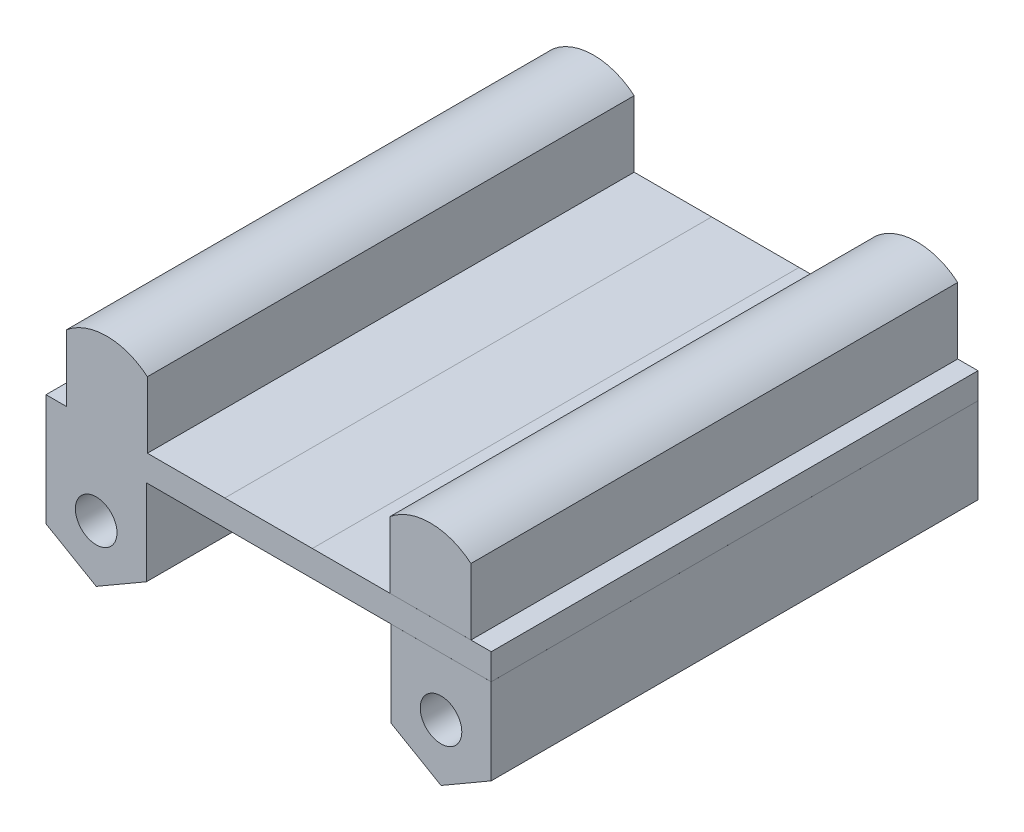
ISO-10303-21;
HEADER;
FILE_DESCRIPTION(('STEP AP214'),'2;1');
FILE_NAME('part.step','',(''),(''),'','','');
FILE_SCHEMA(('AUTOMOTIVE_DESIGN { 1 0 10303 214 1 1 1 1 }'));
ENDSEC;
DATA;
#1=APPLICATION_CONTEXT('core data for automotive mechanical design processes');
#2=APPLICATION_PROTOCOL_DEFINITION('international standard','automotive_design',2000,#1);
#3=PRODUCT_CONTEXT('',#1,'mechanical');
#4=PRODUCT('Part','Part','',(#3));
#5=PRODUCT_RELATED_PRODUCT_CATEGORY('part','',(#4));
#6=PRODUCT_DEFINITION_FORMATION('','',#4);
#7=PRODUCT_DEFINITION_CONTEXT('part definition',#1,'design');
#8=PRODUCT_DEFINITION('design','',#6,#7);
#9=PRODUCT_DEFINITION_SHAPE('','',#8);
#10=(LENGTH_UNIT() NAMED_UNIT(*) SI_UNIT(.MILLI.,.METRE.));
#11=(NAMED_UNIT(*) PLANE_ANGLE_UNIT() SI_UNIT($,.RADIAN.));
#12=(NAMED_UNIT(*) SI_UNIT($,.STERADIAN.) SOLID_ANGLE_UNIT());
#13=UNCERTAINTY_MEASURE_WITH_UNIT(LENGTH_MEASURE(1.E-05),#10,'distance_accuracy_value','');
#14=(GEOMETRIC_REPRESENTATION_CONTEXT(3) GLOBAL_UNCERTAINTY_ASSIGNED_CONTEXT((#13)) GLOBAL_UNIT_ASSIGNED_CONTEXT((#10,
#11,#12)) REPRESENTATION_CONTEXT('',''));
#15=CARTESIAN_POINT('',(0.,0.,0.));
#16=DIRECTION('',(0.,0.,1.));
#17=DIRECTION('',(1.,0.,0.));
#18=AXIS2_PLACEMENT_3D('',#15,#16,#17);
#19=CARTESIAN_POINT('',(20.9500619988679,0.,0.));
#20=DIRECTION('',(1.,0.,0.));
#21=DIRECTION('',(0.,0.,-1.));
#22=AXIS2_PLACEMENT_3D('',#19,#20,#21);
#23=PLANE('',#22);
#24=DIRECTION('',(0.,1.,0.));
#25=VECTOR('',#24,1.);
#26=CARTESIAN_POINT('',(20.9500619988679,0.,24.));
#27=LINE('',#26,#25);
#28=CARTESIAN_POINT('',(20.9500619988679,1.28447350081728,24.));
#29=VERTEX_POINT('',#28);
#30=CARTESIAN_POINT('',(20.9500619988679,4.55180037199449,24.));
#31=VERTEX_POINT('',#30);
#32=EDGE_CURVE('E184',#29,#31,#27,.T.);
#33=ORIENTED_EDGE('',*,*,#32,.F.);
#34=DIRECTION('',(0.,0.,1.));
#35=VECTOR('',#34,1.);
#36=CARTESIAN_POINT('',(20.9500619988679,1.28447350081728,0.));
#37=LINE('',#36,#35);
#38=CARTESIAN_POINT('',(20.9500619988679,1.28447350081728,0.));
#39=VERTEX_POINT('',#38);
#40=EDGE_CURVE('E13',#39,#29,#37,.T.);
#41=ORIENTED_EDGE('',*,*,#40,.F.);
#42=DIRECTION('',(0.,1.,0.));
#43=VECTOR('',#42,1.);
#44=CARTESIAN_POINT('',(20.9500619988679,0.,0.));
#45=LINE('',#44,#43);
#46=CARTESIAN_POINT('',(20.9500619988679,4.55180037199449,0.));
#47=VERTEX_POINT('',#46);
#48=EDGE_CURVE('E179',#39,#47,#45,.T.);
#49=ORIENTED_EDGE('',*,*,#48,.T.);
#50=DIRECTION('',(0.,0.,1.));
#51=VECTOR('',#50,1.);
#52=CARTESIAN_POINT('',(20.9500619988679,4.55180037199449,0.));
#53=LINE('',#52,#51);
#54=EDGE_CURVE('E122',#47,#31,#53,.T.);
#55=ORIENTED_EDGE('',*,*,#54,.T.);
#56=EDGE_LOOP('',(#33,#41,#49,#55));
#57=FACE_BOUND('',#56,.T.);
#58=ADVANCED_FACE('F119',(#57),#23,.T.);
#59=CARTESIAN_POINT('',(0.,1.28447350081728,0.));
#60=DIRECTION('',(0.,1.,0.));
#61=DIRECTION('',(0.,0.,1.));
#62=AXIS2_PLACEMENT_3D('',#59,#60,#61);
#63=PLANE('',#62);
#64=DIRECTION('',(-1.,0.,0.));
#65=VECTOR('',#64,1.);
#66=CARTESIAN_POINT('',(0.,1.28447350081728,24.));
#67=LINE('',#66,#65);
#68=CARTESIAN_POINT('',(16.9500619988679,1.28447350081728,24.));
#69=VERTEX_POINT('',#68);
#70=EDGE_CURVE('E152',#29,#69,#67,.T.);
#71=ORIENTED_EDGE('',*,*,#70,.T.);
#72=DIRECTION('',(0.,0.,1.));
#73=VECTOR('',#72,1.);
#74=CARTESIAN_POINT('',(16.9500619988679,1.28447350081728,0.));
#75=LINE('',#74,#73);
#76=CARTESIAN_POINT('',(16.9500619988679,1.28447350081728,0.));
#77=VERTEX_POINT('',#76);
#78=EDGE_CURVE('E128',#77,#69,#75,.T.);
#79=ORIENTED_EDGE('',*,*,#78,.F.);
#80=DIRECTION('',(-1.,0.,0.));
#81=VECTOR('',#80,1.);
#82=CARTESIAN_POINT('',(0.,1.28447350081728,0.));
#83=LINE('',#82,#81);
#84=EDGE_CURVE('E169',#39,#77,#83,.T.);
#85=ORIENTED_EDGE('',*,*,#84,.F.);
#86=ORIENTED_EDGE('',*,*,#40,.T.);
#87=EDGE_LOOP('',(#71,#79,#85,#86));
#88=FACE_BOUND('',#87,.T.);
#89=ADVANCED_FACE('F194',(#88),#63,.F.);
#90=CARTESIAN_POINT('',(16.9500619988679,0.,0.));
#91=DIRECTION('',(1.,0.,0.));
#92=DIRECTION('',(0.,0.,-1.));
#93=AXIS2_PLACEMENT_3D('',#90,#91,#92);
#94=PLANE('',#93);
#95=DIRECTION('',(0.,1.,0.));
#96=VECTOR('',#95,1.);
#97=CARTESIAN_POINT('',(16.9500619988679,0.,24.));
#98=LINE('',#97,#96);
#99=CARTESIAN_POINT('',(16.9500619988679,4.55180037199449,24.));
#100=VERTEX_POINT('',#99);
#101=EDGE_CURVE('E176',#69,#100,#98,.T.);
#102=ORIENTED_EDGE('',*,*,#101,.T.);
#103=DIRECTION('',(0.,0.,1.));
#104=VECTOR('',#103,1.);
#105=CARTESIAN_POINT('',(16.9500619988679,4.55180037199449,0.));
#106=LINE('',#105,#104);
#107=CARTESIAN_POINT('',(16.9500619988679,4.55180037199449,0.));
#108=VERTEX_POINT('',#107);
#109=EDGE_CURVE('E173',#108,#100,#106,.T.);
#110=ORIENTED_EDGE('',*,*,#109,.F.);
#111=DIRECTION('',(0.,1.,0.));
#112=VECTOR('',#111,1.);
#113=CARTESIAN_POINT('',(16.9500619988679,0.,0.));
#114=LINE('',#113,#112);
#115=EDGE_CURVE('E164',#77,#108,#114,.T.);
#116=ORIENTED_EDGE('',*,*,#115,.F.);
#117=ORIENTED_EDGE('',*,*,#78,.T.);
#118=EDGE_LOOP('',(#102,#110,#116,#117));
#119=FACE_BOUND('',#118,.T.);
#120=ADVANCED_FACE('F174',(#119),#94,.F.);
#121=CARTESIAN_POINT('',(18.9500619988679,2.18840669065026,0.));
#122=DIRECTION('',(0.,0.,1.));
#123=DIRECTION('',(1.,0.,0.));
#124=AXIS2_PLACEMENT_3D('',#121,#122,#123);
#125=CYLINDRICAL_SURFACE('',#124,3.09606681016702);
#126=CARTESIAN_POINT('',(18.9500619988679,2.18840669065026,24.));
#127=DIRECTION('',(0.,0.,1.));
#128=DIRECTION('',(1.,0.,0.));
#129=AXIS2_PLACEMENT_3D('',#126,#127,#128);
#130=CIRCLE('',#129,3.09606681016702);
#131=EDGE_CURVE('E187',#31,#100,#130,.T.);
#132=ORIENTED_EDGE('',*,*,#131,.F.);
#133=ORIENTED_EDGE('',*,*,#54,.F.);
#134=CARTESIAN_POINT('',(18.9500619988679,2.18840669065026,0.));
#135=DIRECTION('',(0.,0.,1.));
#136=DIRECTION('',(1.,0.,0.));
#137=AXIS2_PLACEMENT_3D('',#134,#135,#136);
#138=CIRCLE('',#137,3.09606681016702);
#139=EDGE_CURVE('E168',#47,#108,#138,.T.);
#140=ORIENTED_EDGE('',*,*,#139,.T.);
#141=ORIENTED_EDGE('',*,*,#109,.T.);
#142=EDGE_LOOP('',(#132,#133,#140,#141));
#143=FACE_BOUND('',#142,.T.);
#144=ADVANCED_FACE('F178',(#143),#125,.T.);
#145=CARTESIAN_POINT('',(0.,0.,0.));
#146=DIRECTION('',(0.,0.,1.));
#147=DIRECTION('',(1.,0.,0.));
#148=AXIS2_PLACEMENT_3D('',#145,#146,#147);
#149=PLANE('',#148);
#150=ORIENTED_EDGE('',*,*,#48,.F.);
#151=ORIENTED_EDGE('',*,*,#84,.T.);
#152=ORIENTED_EDGE('',*,*,#115,.T.);
#153=ORIENTED_EDGE('',*,*,#139,.F.);
#154=EDGE_LOOP('',(#150,#151,#152,#153));
#155=FACE_BOUND('',#154,.T.);
#156=ADVANCED_FACE('F167',(#155),#149,.F.);
#157=CARTESIAN_POINT('',(0.,0.,24.));
#158=DIRECTION('',(0.,0.,1.));
#159=DIRECTION('',(1.,0.,0.));
#160=AXIS2_PLACEMENT_3D('',#157,#158,#159);
#161=PLANE('',#160);
#162=ORIENTED_EDGE('',*,*,#32,.T.);
#163=ORIENTED_EDGE('',*,*,#131,.T.);
#164=ORIENTED_EDGE('',*,*,#101,.F.);
#165=ORIENTED_EDGE('',*,*,#70,.F.);
#166=EDGE_LOOP('',(#162,#163,#164,#165));
#167=FACE_BOUND('',#166,.T.);
#168=ADVANCED_FACE('F192',(#167),#161,.T.);
#169=CLOSED_SHELL('',(#58,#89,#120,#144,#156,#168));
#170=MANIFOLD_SOLID_BREP('B2',#169);
#171=CARTESIAN_POINT('',(21.9498374651923,-0.000939459391635629,24.));
#172=DIRECTION('',(-0.999999999084068,4.28002891713858E-05,0.));
#173=DIRECTION('',(-4.28002891713858E-05,-0.999999999084068,0.));
#174=AXIS2_PLACEMENT_3D('',#171,#172,#173);
#175=PLANE('',#174);
#176=DIRECTION('',(4.28002891713858E-05,0.999999999084068,0.));
#177=VECTOR('',#176,1.);
#178=CARTESIAN_POINT('',(21.9498374651923,-0.000939459391635629,0.));
#179=LINE('',#178,#177);
#180=CARTESIAN_POINT('',(21.9498374852968,-0.000469729696067488,0.));
#181=VERTEX_POINT('',#180);
#182=CARTESIAN_POINT('',(21.9498375054014,0.,0.));
#183=VERTEX_POINT('',#182);
#184=EDGE_CURVE('E355',#181,#183,#179,.T.);
#185=ORIENTED_EDGE('',*,*,#184,.F.);
#186=DIRECTION('',(0.,0.,-1.));
#187=VECTOR('',#186,1.);
#188=CARTESIAN_POINT('',(21.9498374852968,-0.000469729696067488,24.));
#189=LINE('',#188,#187);
#190=CARTESIAN_POINT('',(21.9498374852968,-0.000469729696067488,24.));
#191=VERTEX_POINT('',#190);
#192=EDGE_CURVE('E117',#191,#181,#189,.T.);
#193=ORIENTED_EDGE('',*,*,#192,.F.);
#194=DIRECTION('',(4.28002891713858E-05,0.999999999084068,0.));
#195=VECTOR('',#194,1.);
#196=CARTESIAN_POINT('',(21.9498374651923,-0.000939459391635629,24.));
#197=LINE('',#196,#195);
#198=CARTESIAN_POINT('',(21.9498375054014,0.,24.));
#199=VERTEX_POINT('',#198);
#200=EDGE_CURVE('E370',#191,#199,#197,.T.);
#201=ORIENTED_EDGE('',*,*,#200,.T.);
#202=DIRECTION('',(0.,0.,-1.));
#203=VECTOR('',#202,1.);
#204=CARTESIAN_POINT('',(21.9498375054014,0.,24.));
#205=LINE('',#204,#203);
#206=EDGE_CURVE('E283',#199,#183,#205,.T.);
#207=ORIENTED_EDGE('',*,*,#206,.T.);
#208=EDGE_LOOP('',(#185,#193,#201,#207));
#209=FACE_BOUND('',#208,.T.);
#210=ADVANCED_FACE('F267',(#209),#175,.T.);
#211=CARTESIAN_POINT('',(2.01045668255545E-08,0.000469729695637247,24.));
#212=DIRECTION('',(-4.28002891745342E-05,-0.999999999084068,0.));
#213=DIRECTION('',(0.999999999084068,-4.28002891745342E-05,0.));
#214=AXIS2_PLACEMENT_3D('',#211,#212,#213);
#215=PLANE('',#214);
#216=DIRECTION('',(-0.999999999084068,4.28002891745342E-05,0.));
#217=VECTOR('',#216,1.);
#218=CARTESIAN_POINT('',(2.01045668255545E-08,0.000469729695637247,0.));
#219=LINE('',#218,#217);
#220=CARTESIAN_POINT('',(17.,-0.00025787522013579,0.));
#221=VERTEX_POINT('',#220);
#222=EDGE_CURVE('E357',#181,#221,#219,.T.);
#223=ORIENTED_EDGE('',*,*,#222,.T.);
#224=DIRECTION('',(0.,0.,-1.));
#225=VECTOR('',#224,1.);
#226=CARTESIAN_POINT('',(17.,-0.00025787522013579,24.));
#227=LINE('',#226,#225);
#228=CARTESIAN_POINT('',(17.,-0.00025787522013579,24.));
#229=VERTEX_POINT('',#228);
#230=EDGE_CURVE('E275',#229,#221,#227,.T.);
#231=ORIENTED_EDGE('',*,*,#230,.F.);
#232=DIRECTION('',(-0.999999999084068,4.28002891745342E-05,0.));
#233=VECTOR('',#232,1.);
#234=CARTESIAN_POINT('',(2.01045668255545E-08,0.000469729695637247,24.));
#235=LINE('',#234,#233);
#236=EDGE_CURVE('E391',#191,#229,#235,.T.);
#237=ORIENTED_EDGE('',*,*,#236,.F.);
#238=ORIENTED_EDGE('',*,*,#192,.T.);
#239=EDGE_LOOP('',(#223,#231,#237,#238));
#240=FACE_BOUND('',#239,.T.);
#241=ADVANCED_FACE('F449',(#240),#215,.F.);
#242=CARTESIAN_POINT('',(17.,0.,24.));
#243=DIRECTION('',(1.,0.,0.));
#244=DIRECTION('',(0.,0.,-1.));
#245=AXIS2_PLACEMENT_3D('',#242,#243,#244);
#246=PLANE('',#245);
#247=DIRECTION('',(0.,-1.,0.));
#248=VECTOR('',#247,1.);
#249=CARTESIAN_POINT('',(17.,0.,0.));
#250=LINE('',#249,#248);
#251=CARTESIAN_POINT('',(17.,-4.23,0.));
#252=VERTEX_POINT('',#251);
#253=EDGE_CURVE('E360',#221,#252,#250,.T.);
#254=ORIENTED_EDGE('',*,*,#253,.T.);
#255=DIRECTION('',(0.,0.,-1.));
#256=VECTOR('',#255,1.);
#257=CARTESIAN_POINT('',(17.,-4.23,24.));
#258=LINE('',#257,#256);
#259=CARTESIAN_POINT('',(17.,-4.23,24.));
#260=VERTEX_POINT('',#259);
#261=EDGE_CURVE('E374',#260,#252,#258,.T.);
#262=ORIENTED_EDGE('',*,*,#261,.F.);
#263=DIRECTION('',(0.,-1.,0.));
#264=VECTOR('',#263,1.);
#265=CARTESIAN_POINT('',(17.,0.,24.));
#266=LINE('',#265,#264);
#267=EDGE_CURVE('E383',#229,#260,#266,.T.);
#268=ORIENTED_EDGE('',*,*,#267,.F.);
#269=ORIENTED_EDGE('',*,*,#230,.T.);
#270=EDGE_LOOP('',(#254,#262,#268,#269));
#271=FACE_BOUND('',#270,.T.);
#272=ADVANCED_FACE('F381',(#271),#246,.F.);
#273=CARTESIAN_POINT('',(2.4345156901417,4.2042661826246,24.));
#274=DIRECTION('',(0.50110823926136,0.865384615384616,0.));
#275=DIRECTION('',(-0.865384615384616,0.50110823926136,0.));
#276=AXIS2_PLACEMENT_3D('',#273,#274,#275);
#277=PLANE('',#276);
#278=DIRECTION('',(0.865384615384616,-0.50110823926136,0.));
#279=VECTOR('',#278,1.);
#280=CARTESIAN_POINT('',(2.4345156901417,4.2042661826246,0.));
#281=LINE('',#280,#279);
#282=CARTESIAN_POINT('',(19.475,-5.66316956428749,0.));
#283=VERTEX_POINT('',#282);
#284=EDGE_CURVE('E362',#252,#283,#281,.T.);
#285=ORIENTED_EDGE('',*,*,#284,.T.);
#286=DIRECTION('',(0.,0.,-1.));
#287=VECTOR('',#286,1.);
#288=CARTESIAN_POINT('',(19.475,-5.66316956428749,24.));
#289=LINE('',#288,#287);
#290=CARTESIAN_POINT('',(19.475,-5.66316956428749,24.));
#291=VERTEX_POINT('',#290);
#292=EDGE_CURVE('E347',#291,#283,#289,.T.);
#293=ORIENTED_EDGE('',*,*,#292,.F.);
#294=DIRECTION('',(0.865384615384616,-0.50110823926136,0.));
#295=VECTOR('',#294,1.);
#296=CARTESIAN_POINT('',(2.4345156901417,4.2042661826246,24.));
#297=LINE('',#296,#295);
#298=EDGE_CURVE('E335',#260,#291,#297,.T.);
#299=ORIENTED_EDGE('',*,*,#298,.F.);
#300=ORIENTED_EDGE('',*,*,#261,.T.);
#301=EDGE_LOOP('',(#285,#293,#299,#300));
#302=FACE_BOUND('',#301,.T.);
#303=ADVANCED_FACE('F390',(#302),#277,.F.);
#304=CARTESIAN_POINT('',(7.34619806725475,-12.6864543244014,24.));
#305=DIRECTION('',(-0.501108239261361,0.865384615384615,0.));
#306=DIRECTION('',(-0.865384615384615,-0.501108239261361,0.));
#307=AXIS2_PLACEMENT_3D('',#304,#305,#306);
#308=PLANE('',#307);
#309=DIRECTION('',(0.865384615384615,0.501108239261361,0.));
#310=VECTOR('',#309,1.);
#311=CARTESIAN_POINT('',(7.34619806725475,-12.6864543244014,0.));
#312=LINE('',#311,#310);
#313=CARTESIAN_POINT('',(21.95,-4.23,0.));
#314=VERTEX_POINT('',#313);
#315=EDGE_CURVE('E344',#283,#314,#312,.T.);
#316=ORIENTED_EDGE('',*,*,#315,.T.);
#317=DIRECTION('',(0.,0.,-1.));
#318=VECTOR('',#317,1.);
#319=CARTESIAN_POINT('',(21.95,-4.23,24.));
#320=LINE('',#319,#318);
#321=CARTESIAN_POINT('',(21.95,-4.23,24.));
#322=VERTEX_POINT('',#321);
#323=EDGE_CURVE('E341',#322,#314,#320,.T.);
#324=ORIENTED_EDGE('',*,*,#323,.F.);
#325=DIRECTION('',(0.865384615384615,0.501108239261361,0.));
#326=VECTOR('',#325,1.);
#327=CARTESIAN_POINT('',(7.34619806725475,-12.6864543244014,24.));
#328=LINE('',#327,#326);
#329=EDGE_CURVE('E327',#291,#322,#328,.T.);
#330=ORIENTED_EDGE('',*,*,#329,.F.);
#331=ORIENTED_EDGE('',*,*,#292,.T.);
#332=EDGE_LOOP('',(#316,#324,#330,#331));
#333=FACE_BOUND('',#332,.T.);
#334=ADVANCED_FACE('F342',(#333),#308,.F.);
#335=CARTESIAN_POINT('',(21.95,0.,24.));
#336=DIRECTION('',(1.,0.,0.));
#337=DIRECTION('',(0.,0.,-1.));
#338=AXIS2_PLACEMENT_3D('',#335,#336,#337);
#339=PLANE('',#338);
#340=DIRECTION('',(0.,-1.,0.));
#341=VECTOR('',#340,1.);
#342=CARTESIAN_POINT('',(21.95,0.,0.));
#343=LINE('',#342,#341);
#344=CARTESIAN_POINT('',(21.95,0.,0.));
#345=VERTEX_POINT('',#344);
#346=EDGE_CURVE('E365',#345,#314,#343,.T.);
#347=ORIENTED_EDGE('',*,*,#346,.F.);
#348=DIRECTION('',(0.,0.,-1.));
#349=VECTOR('',#348,1.);
#350=CARTESIAN_POINT('',(21.95,0.,24.));
#351=LINE('',#350,#349);
#352=CARTESIAN_POINT('',(21.95,0.,24.));
#353=VERTEX_POINT('',#352);
#354=EDGE_CURVE('E305',#353,#345,#351,.T.);
#355=ORIENTED_EDGE('',*,*,#354,.F.);
#356=DIRECTION('',(0.,-1.,0.));
#357=VECTOR('',#356,1.);
#358=CARTESIAN_POINT('',(21.95,0.,24.));
#359=LINE('',#358,#357);
#360=EDGE_CURVE('E333',#353,#322,#359,.T.);
#361=ORIENTED_EDGE('',*,*,#360,.T.);
#362=ORIENTED_EDGE('',*,*,#323,.T.);
#363=EDGE_LOOP('',(#347,#355,#361,#362));
#364=FACE_BOUND('',#363,.T.);
#365=ADVANCED_FACE('F349',(#364),#339,.T.);
#366=CARTESIAN_POINT('',(0.,0.,24.));
#367=DIRECTION('',(0.,1.,0.));
#368=DIRECTION('',(0.,0.,1.));
#369=AXIS2_PLACEMENT_3D('',#366,#367,#368);
#370=PLANE('',#369);
#371=DIRECTION('',(1.,0.,0.));
#372=VECTOR('',#371,1.);
#373=CARTESIAN_POINT('',(0.,0.,0.));
#374=LINE('',#373,#372);
#375=EDGE_CURVE('E367',#183,#345,#374,.T.);
#376=ORIENTED_EDGE('',*,*,#375,.F.);
#377=ORIENTED_EDGE('',*,*,#206,.F.);
#378=DIRECTION('',(1.,0.,0.));
#379=VECTOR('',#378,1.);
#380=CARTESIAN_POINT('',(0.,0.,24.));
#381=LINE('',#380,#379);
#382=EDGE_CURVE('E350',#199,#353,#381,.T.);
#383=ORIENTED_EDGE('',*,*,#382,.T.);
#384=ORIENTED_EDGE('',*,*,#354,.T.);
#385=EDGE_LOOP('',(#376,#377,#383,#384));
#386=FACE_BOUND('',#385,.T.);
#387=ADVANCED_FACE('F444',(#386),#370,.T.);
#388=CARTESIAN_POINT('',(0.,0.,24.));
#389=DIRECTION('',(0.,0.,1.));
#390=DIRECTION('',(1.,0.,0.));
#391=AXIS2_PLACEMENT_3D('',#388,#389,#390);
#392=PLANE('',#391);
#393=CARTESIAN_POINT('',(19.475,-2.86316956428749,24.));
#394=DIRECTION('',(0.,0.,1.));
#395=DIRECTION('',(1.,0.,0.));
#396=AXIS2_PLACEMENT_3D('',#393,#394,#395);
#397=CIRCLE('',#396,1.025);
#398=CARTESIAN_POINT('',(20.5,-2.86316956428749,24.));
#399=VERTEX_POINT('',#398);
#400=EDGE_CURVE('E358',#399,#399,#397,.T.);
#401=ORIENTED_EDGE('',*,*,#400,.F.);
#402=EDGE_LOOP('',(#401));
#403=FACE_BOUND('',#402,.T.);
#404=ORIENTED_EDGE('',*,*,#200,.F.);
#405=ORIENTED_EDGE('',*,*,#236,.T.);
#406=ORIENTED_EDGE('',*,*,#267,.T.);
#407=ORIENTED_EDGE('',*,*,#298,.T.);
#408=ORIENTED_EDGE('',*,*,#329,.T.);
#409=ORIENTED_EDGE('',*,*,#360,.F.);
#410=ORIENTED_EDGE('',*,*,#382,.F.);
#411=EDGE_LOOP('',(#404,#405,#406,#407,#408,#409,#410));
#412=FACE_BOUND('',#411,.T.);
#413=ADVANCED_FACE('F330',(#403,#412),#392,.T.);
#414=CARTESIAN_POINT('',(0.,0.,0.));
#415=DIRECTION('',(0.,0.,1.));
#416=DIRECTION('',(1.,0.,0.));
#417=AXIS2_PLACEMENT_3D('',#414,#415,#416);
#418=PLANE('',#417);
#419=CARTESIAN_POINT('',(19.475,-2.86316956428749,0.));
#420=DIRECTION('',(0.,0.,-1.));
#421=DIRECTION('',(-1.,0.,0.));
#422=AXIS2_PLACEMENT_3D('',#419,#420,#421);
#423=CIRCLE('',#422,1.025);
#424=CARTESIAN_POINT('',(18.45,-2.86316956428749,0.));
#425=VERTEX_POINT('',#424);
#426=EDGE_CURVE('E402',#425,#425,#423,.T.);
#427=ORIENTED_EDGE('',*,*,#426,.F.);
#428=EDGE_LOOP('',(#427));
#429=FACE_BOUND('',#428,.T.);
#430=ORIENTED_EDGE('',*,*,#184,.T.);
#431=ORIENTED_EDGE('',*,*,#375,.T.);
#432=ORIENTED_EDGE('',*,*,#346,.T.);
#433=ORIENTED_EDGE('',*,*,#315,.F.);
#434=ORIENTED_EDGE('',*,*,#284,.F.);
#435=ORIENTED_EDGE('',*,*,#253,.F.);
#436=ORIENTED_EDGE('',*,*,#222,.F.);
#437=EDGE_LOOP('',(#430,#431,#432,#433,#434,#435,#436));
#438=FACE_BOUND('',#437,.T.);
#439=ADVANCED_FACE('F388',(#429,#438),#418,.F.);
#440=CARTESIAN_POINT('',(19.475,-2.86316956428749,19.));
#441=DIRECTION('',(0.,0.,1.));
#442=DIRECTION('',(1.,0.,0.));
#443=AXIS2_PLACEMENT_3D('',#440,#441,#442);
#444=CYLINDRICAL_SURFACE('',#443,1.025);
#445=CARTESIAN_POINT('',(19.475,-2.86316956428749,19.));
#446=DIRECTION('',(0.,0.,1.));
#447=DIRECTION('',(1.,0.,0.));
#448=AXIS2_PLACEMENT_3D('',#445,#446,#447);
#449=CIRCLE('',#448,1.025);
#450=CARTESIAN_POINT('',(20.5,-2.86316956428749,19.));
#451=VERTEX_POINT('',#450);
#452=EDGE_CURVE('E396',#451,#451,#449,.T.);
#453=ORIENTED_EDGE('',*,*,#452,.F.);
#454=EDGE_LOOP('',(#453));
#455=FACE_BOUND('',#454,.T.);
#456=ORIENTED_EDGE('',*,*,#400,.T.);
#457=EDGE_LOOP('',(#456));
#458=FACE_BOUND('',#457,.T.);
#459=ADVANCED_FACE('F436',(#455,#458),#444,.F.);
#460=CARTESIAN_POINT('',(19.475,-2.86316956428749,19.));
#461=DIRECTION('',(0.,0.,1.));
#462=DIRECTION('',(1.,0.,0.));
#463=AXIS2_PLACEMENT_3D('',#460,#461,#462);
#464=PLANE('',#463);
#465=CARTESIAN_POINT('',(19.475,-2.86316956428749,19.));
#466=DIRECTION('',(0.,0.,-1.));
#467=DIRECTION('',(-1.,0.,0.));
#468=AXIS2_PLACEMENT_3D('',#465,#466,#467);
#469=CIRCLE('',#468,0.9);
#470=CARTESIAN_POINT('',(18.575,-2.86316956428749,19.));
#471=VERTEX_POINT('',#470);
#472=EDGE_CURVE('E405',#471,#471,#469,.T.);
#473=ORIENTED_EDGE('',*,*,#472,.T.);
#474=EDGE_LOOP('',(#473));
#475=FACE_BOUND('',#474,.T.);
#476=ORIENTED_EDGE('',*,*,#452,.T.);
#477=EDGE_LOOP('',(#476));
#478=FACE_BOUND('',#477,.T.);
#479=ADVANCED_FACE('F414',(#475,#478),#464,.T.);
#480=CARTESIAN_POINT('',(19.475,-2.86316956428749,5.));
#481=DIRECTION('',(0.,0.,-1.));
#482=DIRECTION('',(-1.,0.,0.));
#483=AXIS2_PLACEMENT_3D('',#480,#481,#482);
#484=CYLINDRICAL_SURFACE('',#483,1.025);
#485=CARTESIAN_POINT('',(19.475,-2.86316956428749,5.));
#486=DIRECTION('',(0.,0.,-1.));
#487=DIRECTION('',(-1.,0.,0.));
#488=AXIS2_PLACEMENT_3D('',#485,#486,#487);
#489=CIRCLE('',#488,1.025);
#490=CARTESIAN_POINT('',(18.45,-2.86316956428749,5.));
#491=VERTEX_POINT('',#490);
#492=EDGE_CURVE('E399',#491,#491,#489,.T.);
#493=ORIENTED_EDGE('',*,*,#492,.F.);
#494=EDGE_LOOP('',(#493));
#495=FACE_BOUND('',#494,.T.);
#496=ORIENTED_EDGE('',*,*,#426,.T.);
#497=EDGE_LOOP('',(#496));
#498=FACE_BOUND('',#497,.T.);
#499=ADVANCED_FACE('F426',(#495,#498),#484,.F.);
#500=CARTESIAN_POINT('',(0.,0.,5.));
#501=DIRECTION('',(0.,0.,-1.));
#502=DIRECTION('',(-1.,0.,0.));
#503=AXIS2_PLACEMENT_3D('',#500,#501,#502);
#504=PLANE('',#503);
#505=CARTESIAN_POINT('',(19.475,-2.86316956428749,5.));
#506=DIRECTION('',(0.,0.,-1.));
#507=DIRECTION('',(-1.,0.,0.));
#508=AXIS2_PLACEMENT_3D('',#505,#506,#507);
#509=CIRCLE('',#508,0.9);
#510=CARTESIAN_POINT('',(18.575,-2.86316956428749,5.));
#511=VERTEX_POINT('',#510);
#512=EDGE_CURVE('E408',#511,#511,#509,.T.);
#513=ORIENTED_EDGE('',*,*,#512,.F.);
#514=EDGE_LOOP('',(#513));
#515=FACE_BOUND('',#514,.T.);
#516=ORIENTED_EDGE('',*,*,#492,.T.);
#517=EDGE_LOOP('',(#516));
#518=FACE_BOUND('',#517,.T.);
#519=ADVANCED_FACE('F420',(#515,#518),#504,.T.);
#520=CARTESIAN_POINT('',(19.475,-2.86316956428749,19.));
#521=DIRECTION('',(0.,0.,-1.));
#522=DIRECTION('',(-1.,0.,0.));
#523=AXIS2_PLACEMENT_3D('',#520,#521,#522);
#524=CYLINDRICAL_SURFACE('',#523,0.9);
#525=ORIENTED_EDGE('',*,*,#472,.F.);
#526=EDGE_LOOP('',(#525));
#527=FACE_BOUND('',#526,.T.);
#528=ORIENTED_EDGE('',*,*,#512,.T.);
#529=EDGE_LOOP('',(#528));
#530=FACE_BOUND('',#529,.T.);
#531=ADVANCED_FACE('F417',(#527,#530),#524,.F.);
#532=CLOSED_SHELL('',(#210,#241,#272,#303,#334,#365,#387,#413,#439,#459,#479,#499,#519,#531));
#533=MANIFOLD_SOLID_BREP('B7',#532);
#534=CARTESIAN_POINT('',(0.,1.28447350081728,24.));
#535=DIRECTION('',(0.,1.,0.));
#536=DIRECTION('',(0.,0.,1.));
#537=AXIS2_PLACEMENT_3D('',#534,#535,#536);
#538=PLANE('',#537);
#539=DIRECTION('',(1.,0.,0.));
#540=VECTOR('',#539,1.);
#541=CARTESIAN_POINT('',(0.,1.28447350081728,0.));
#542=LINE('',#541,#540);
#543=CARTESIAN_POINT('',(4.99983047034324,1.28447350081728,0.));
#544=VERTEX_POINT('',#543);
#545=CARTESIAN_POINT('',(8.81833490961792,1.28447350081728,0.));
#546=VERTEX_POINT('',#545);
#547=EDGE_CURVE('E722',#544,#546,#542,.T.);
#548=ORIENTED_EDGE('',*,*,#547,.F.);
#549=DIRECTION('',(0.,0.,1.));
#550=VECTOR('',#549,1.);
#551=CARTESIAN_POINT('',(4.99983047034324,1.28447350081728,0.));
#552=LINE('',#551,#550);
#553=CARTESIAN_POINT('',(4.99983047034324,1.28447350081728,24.));
#554=VERTEX_POINT('',#553);
#555=EDGE_CURVE('E858',#544,#554,#552,.T.);
#556=ORIENTED_EDGE('',*,*,#555,.T.);
#557=DIRECTION('',(1.,0.,0.));
#558=VECTOR('',#557,1.);
#559=CARTESIAN_POINT('',(0.,1.28447350081728,24.));
#560=LINE('',#559,#558);
#561=CARTESIAN_POINT('',(8.81833490961792,1.28447350081728,24.));
#562=VERTEX_POINT('',#561);
#563=EDGE_CURVE('E857',#554,#562,#560,.T.);
#564=ORIENTED_EDGE('',*,*,#563,.T.);
#565=DIRECTION('',(0.,0.,-1.));
#566=VECTOR('',#565,1.);
#567=CARTESIAN_POINT('',(8.81833490961792,1.28447350081728,24.));
#568=LINE('',#567,#566);
#569=EDGE_CURVE('E776',#562,#546,#568,.T.);
#570=ORIENTED_EDGE('',*,*,#569,.T.);
#571=EDGE_LOOP('',(#548,#556,#564,#570));
#572=FACE_BOUND('',#571,.T.);
#573=ADVANCED_FACE('F581',(#572),#538,.T.);
#574=CARTESIAN_POINT('',(21.9498374651923,-0.000939459391635629,24.));
#575=DIRECTION('',(-0.999999999084068,4.28002891713858E-05,0.));
#576=DIRECTION('',(-4.28002891713858E-05,-0.999999999084068,0.));
#577=AXIS2_PLACEMENT_3D('',#574,#575,#576);
#578=PLANE('',#577);
#579=DIRECTION('',(4.28002891713858E-05,0.999999999084068,0.));
#580=VECTOR('',#579,1.);
#581=CARTESIAN_POINT('',(21.9498374651923,-0.000939459391635629,0.));
#582=LINE('',#581,#580);
#583=CARTESIAN_POINT('',(21.9498375054014,0.,0.));
#584=VERTEX_POINT('',#583);
#585=CARTESIAN_POINT('',(21.9498924611341,1.28400376994473,0.));
#586=VERTEX_POINT('',#585);
#587=EDGE_CURVE('E713',#584,#586,#582,.T.);
#588=ORIENTED_EDGE('',*,*,#587,.T.);
#589=DIRECTION('',(0.,0.,-1.));
#590=VECTOR('',#589,1.);
#591=CARTESIAN_POINT('',(21.9498924611341,1.28400376994473,24.));
#592=LINE('',#591,#590);
#593=CARTESIAN_POINT('',(21.9498924611341,1.28400376994473,24.));
#594=VERTEX_POINT('',#593);
#595=EDGE_CURVE('E265',#594,#586,#592,.T.);
#596=ORIENTED_EDGE('',*,*,#595,.F.);
#597=DIRECTION('',(4.28002891713858E-05,0.999999999084068,0.));
#598=VECTOR('',#597,1.);
#599=CARTESIAN_POINT('',(21.9498374651923,-0.000939459391635629,24.));
#600=LINE('',#599,#598);
#601=CARTESIAN_POINT('',(21.9498375054014,0.,24.));
#602=VERTEX_POINT('',#601);
#603=EDGE_CURVE('E753',#602,#594,#600,.T.);
#604=ORIENTED_EDGE('',*,*,#603,.F.);
#605=DIRECTION('',(0.,0.,-1.));
#606=VECTOR('',#605,1.);
#607=CARTESIAN_POINT('',(21.9498375054014,0.,24.));
#608=LINE('',#607,#606);
#609=EDGE_CURVE('E709',#602,#584,#608,.T.);
#610=ORIENTED_EDGE('',*,*,#609,.T.);
#611=EDGE_LOOP('',(#588,#596,#604,#610));
#612=FACE_BOUND('',#611,.T.);
#613=ADVANCED_FACE('F583',(#612),#578,.F.);
#614=CARTESIAN_POINT('',(5.4995941838842E-05,1.28494322933643,24.));
#615=DIRECTION('',(-4.28002891745422E-05,-0.999999999084068,0.));
#616=DIRECTION('',(0.999999999084068,-4.28002891745422E-05,0.));
#617=AXIS2_PLACEMENT_3D('',#614,#615,#616);
#618=PLANE('',#617);
#619=DIRECTION('',(-0.999999999084068,4.28002891745422E-05,0.));
#620=VECTOR('',#619,1.);
#621=CARTESIAN_POINT('',(5.4995941838842E-05,1.28494322933643,0.));
#622=LINE('',#621,#620);
#623=CARTESIAN_POINT('',(13.1315575595932,1.2843811972289,0.));
#624=VERTEX_POINT('',#623);
#625=EDGE_CURVE('E717',#586,#624,#622,.T.);
#626=ORIENTED_EDGE('',*,*,#625,.T.);
#627=DIRECTION('',(0.,0.,-1.));
#628=VECTOR('',#627,1.);
#629=CARTESIAN_POINT('',(13.1315575595932,1.2843811972289,24.));
#630=LINE('',#629,#628);
#631=CARTESIAN_POINT('',(13.1315575595932,1.2843811972289,24.));
#632=VERTEX_POINT('',#631);
#633=EDGE_CURVE('E590',#632,#624,#630,.T.);
#634=ORIENTED_EDGE('',*,*,#633,.F.);
#635=DIRECTION('',(-0.999999999084068,4.28002891745422E-05,0.));
#636=VECTOR('',#635,1.);
#637=CARTESIAN_POINT('',(5.4995941838842E-05,1.28494322933643,24.));
#638=LINE('',#637,#636);
#639=EDGE_CURVE('E656',#594,#632,#638,.T.);
#640=ORIENTED_EDGE('',*,*,#639,.F.);
#641=ORIENTED_EDGE('',*,*,#595,.T.);
#642=EDGE_LOOP('',(#626,#634,#640,#641));
#643=FACE_BOUND('',#642,.T.);
#644=ADVANCED_FACE('F797',(#643),#618,.F.);
#645=DIRECTION('',(0.,0.,1.));
#646=VECTOR('',#645,1.);
#647=CARTESIAN_POINT('',(0.999830470343237,1.28447350081728,0.));
#648=LINE('',#647,#646);
#649=CARTESIAN_POINT('',(0.999830470343237,1.28447350081728,0.));
#650=VERTEX_POINT('',#649);
#651=CARTESIAN_POINT('',(0.999830470343237,1.28447350081728,24.));
#652=VERTEX_POINT('',#651);
#653=EDGE_CURVE('E831',#650,#652,#648,.T.);
#654=ORIENTED_EDGE('',*,*,#653,.F.);
#655=CARTESIAN_POINT('',(0.,1.28447350081728,0.));
#656=VERTEX_POINT('',#655);
#657=EDGE_CURVE('E723',#656,#650,#542,.T.);
#658=ORIENTED_EDGE('',*,*,#657,.F.);
#659=DIRECTION('',(0.,0.,-1.));
#660=VECTOR('',#659,1.);
#661=CARTESIAN_POINT('',(0.,1.28447350081728,24.));
#662=LINE('',#661,#660);
#663=CARTESIAN_POINT('',(0.,1.28447350081728,24.));
#664=VERTEX_POINT('',#663);
#665=EDGE_CURVE('E773',#664,#656,#662,.T.);
#666=ORIENTED_EDGE('',*,*,#665,.F.);
#667=EDGE_CURVE('E860',#664,#652,#560,.T.);
#668=ORIENTED_EDGE('',*,*,#667,.T.);
#669=EDGE_LOOP('',(#654,#658,#666,#668));
#670=FACE_BOUND('',#669,.T.);
#671=ADVANCED_FACE('F828',(#670),#538,.T.);
#672=CARTESIAN_POINT('',(0.,0.,24.));
#673=DIRECTION('',(-1.,0.,0.));
#674=DIRECTION('',(0.,0.,1.));
#675=AXIS2_PLACEMENT_3D('',#672,#673,#674);
#676=PLANE('',#675);
#677=DIRECTION('',(0.,1.,0.));
#678=VECTOR('',#677,1.);
#679=CARTESIAN_POINT('',(0.,0.,0.));
#680=LINE('',#679,#678);
#681=CARTESIAN_POINT('',(0.,-4.23,0.));
#682=VERTEX_POINT('',#681);
#683=EDGE_CURVE('E727',#682,#656,#680,.T.);
#684=ORIENTED_EDGE('',*,*,#683,.F.);
#685=DIRECTION('',(0.,0.,-1.));
#686=VECTOR('',#685,1.);
#687=CARTESIAN_POINT('',(0.,-4.23,24.));
#688=LINE('',#687,#686);
#689=CARTESIAN_POINT('',(0.,-4.23,24.));
#690=VERTEX_POINT('',#689);
#691=EDGE_CURVE('E770',#690,#682,#688,.T.);
#692=ORIENTED_EDGE('',*,*,#691,.F.);
#693=DIRECTION('',(0.,1.,0.));
#694=VECTOR('',#693,1.);
#695=CARTESIAN_POINT('',(0.,0.,24.));
#696=LINE('',#695,#694);
#697=EDGE_CURVE('E823',#690,#664,#696,.T.);
#698=ORIENTED_EDGE('',*,*,#697,.T.);
#699=ORIENTED_EDGE('',*,*,#665,.T.);
#700=EDGE_LOOP('',(#684,#692,#698,#699));
#701=FACE_BOUND('',#700,.T.);
#702=ADVANCED_FACE('F818',(#701),#676,.T.);
#703=CARTESIAN_POINT('',(-1.83434525660385,-3.16780695266272,24.));
#704=DIRECTION('',(0.501108239261361,0.865384615384615,0.));
#705=DIRECTION('',(-0.865384615384616,0.501108239261361,0.));
#706=AXIS2_PLACEMENT_3D('',#703,#704,#705);
#707=PLANE('',#706);
#708=DIRECTION('',(0.865384615384616,-0.501108239261361,0.));
#709=VECTOR('',#708,1.);
#710=CARTESIAN_POINT('',(-1.83434525660385,-3.16780695266272,0.));
#711=LINE('',#710,#709);
#712=CARTESIAN_POINT('',(2.475,-5.66316956428749,0.));
#713=VERTEX_POINT('',#712);
#714=EDGE_CURVE('E731',#682,#713,#711,.T.);
#715=ORIENTED_EDGE('',*,*,#714,.T.);
#716=DIRECTION('',(0.,0.,-1.));
#717=VECTOR('',#716,1.);
#718=CARTESIAN_POINT('',(2.475,-5.66316956428749,24.));
#719=LINE('',#718,#717);
#720=CARTESIAN_POINT('',(2.475,-5.66316956428749,24.));
#721=VERTEX_POINT('',#720);
#722=EDGE_CURVE('E766',#721,#713,#719,.T.);
#723=ORIENTED_EDGE('',*,*,#722,.F.);
#724=DIRECTION('',(0.865384615384616,-0.501108239261361,0.));
#725=VECTOR('',#724,1.);
#726=CARTESIAN_POINT('',(-1.83434525660385,-3.16780695266272,24.));
#727=LINE('',#726,#725);
#728=EDGE_CURVE('E898',#690,#721,#727,.T.);
#729=ORIENTED_EDGE('',*,*,#728,.F.);
#730=ORIENTED_EDGE('',*,*,#691,.T.);
#731=EDGE_LOOP('',(#715,#723,#729,#730));
#732=FACE_BOUND('',#731,.T.);
#733=ADVANCED_FACE('F907',(#732),#707,.F.);
#734=CARTESIAN_POINT('',(3.07733712050917,-5.31438118911403,24.));
#735=DIRECTION('',(-0.501108239261361,0.865384615384615,0.));
#736=DIRECTION('',(-0.865384615384616,-0.501108239261361,0.));
#737=AXIS2_PLACEMENT_3D('',#734,#735,#736);
#738=PLANE('',#737);
#739=DIRECTION('',(0.865384615384616,0.501108239261361,0.));
#740=VECTOR('',#739,1.);
#741=CARTESIAN_POINT('',(3.07733712050917,-5.31438118911403,0.));
#742=LINE('',#741,#740);
#743=CARTESIAN_POINT('',(4.95,-4.23,0.));
#744=VERTEX_POINT('',#743);
#745=EDGE_CURVE('E734',#713,#744,#742,.T.);
#746=ORIENTED_EDGE('',*,*,#745,.T.);
#747=DIRECTION('',(0.,0.,-1.));
#748=VECTOR('',#747,1.);
#749=CARTESIAN_POINT('',(4.95,-4.23,24.));
#750=LINE('',#749,#748);
#751=CARTESIAN_POINT('',(4.95,-4.23,24.));
#752=VERTEX_POINT('',#751);
#753=EDGE_CURVE('E763',#752,#744,#750,.T.);
#754=ORIENTED_EDGE('',*,*,#753,.F.);
#755=DIRECTION('',(0.865384615384616,0.501108239261361,0.));
#756=VECTOR('',#755,1.);
#757=CARTESIAN_POINT('',(3.07733712050917,-5.31438118911403,24.));
#758=LINE('',#757,#756);
#759=EDGE_CURVE('E901',#721,#752,#758,.T.);
#760=ORIENTED_EDGE('',*,*,#759,.F.);
#761=ORIENTED_EDGE('',*,*,#722,.T.);
#762=EDGE_LOOP('',(#746,#754,#760,#761));
#763=FACE_BOUND('',#762,.T.);
#764=ADVANCED_FACE('F812',(#763),#738,.F.);
#765=CARTESIAN_POINT('',(4.95,0.,24.));
#766=DIRECTION('',(1.,0.,0.));
#767=DIRECTION('',(0.,1.,0.));
#768=AXIS2_PLACEMENT_3D('',#765,#766,#767);
#769=PLANE('',#768);
#770=DIRECTION('',(0.,-1.,0.));
#771=VECTOR('',#770,1.);
#772=CARTESIAN_POINT('',(4.95,0.,0.));
#773=LINE('',#772,#771);
#774=CARTESIAN_POINT('',(4.95,0.,0.));
#775=VERTEX_POINT('',#774);
#776=EDGE_CURVE('E738',#775,#744,#773,.T.);
#777=ORIENTED_EDGE('',*,*,#776,.F.);
#778=DIRECTION('',(0.,0.,-1.));
#779=VECTOR('',#778,1.);
#780=CARTESIAN_POINT('',(4.95,0.,24.));
#781=LINE('',#780,#779);
#782=CARTESIAN_POINT('',(4.95,0.,24.));
#783=VERTEX_POINT('',#782);
#784=EDGE_CURVE('E760',#783,#775,#781,.T.);
#785=ORIENTED_EDGE('',*,*,#784,.F.);
#786=DIRECTION('',(0.,-1.,0.));
#787=VECTOR('',#786,1.);
#788=CARTESIAN_POINT('',(4.95,0.,24.));
#789=LINE('',#788,#787);
#790=EDGE_CURVE('E809',#783,#752,#789,.T.);
#791=ORIENTED_EDGE('',*,*,#790,.T.);
#792=ORIENTED_EDGE('',*,*,#753,.T.);
#793=EDGE_LOOP('',(#777,#785,#791,#792));
#794=FACE_BOUND('',#793,.T.);
#795=ADVANCED_FACE('F806',(#794),#769,.T.);
#796=CARTESIAN_POINT('',(0.,0.,24.));
#797=DIRECTION('',(0.,1.,0.));
#798=DIRECTION('',(0.,0.,1.));
#799=AXIS2_PLACEMENT_3D('',#796,#797,#798);
#800=PLANE('',#799);
#801=DIRECTION('',(1.,0.,0.));
#802=VECTOR('',#801,1.);
#803=CARTESIAN_POINT('',(0.,0.,0.));
#804=LINE('',#803,#802);
#805=CARTESIAN_POINT('',(10.9749187476746,0.,0.));
#806=VERTEX_POINT('',#805);
#807=EDGE_CURVE('E742',#775,#806,#804,.T.);
#808=ORIENTED_EDGE('',*,*,#807,.T.);
#809=DIRECTION('',(0.,0.,-1.));
#810=VECTOR('',#809,1.);
#811=CARTESIAN_POINT('',(10.9749187476746,0.,24.));
#812=LINE('',#811,#810);
#813=CARTESIAN_POINT('',(10.9749187476746,0.,24.));
#814=VERTEX_POINT('',#813);
#815=EDGE_CURVE('E692',#814,#806,#812,.T.);
#816=ORIENTED_EDGE('',*,*,#815,.F.);
#817=DIRECTION('',(1.,0.,0.));
#818=VECTOR('',#817,1.);
#819=CARTESIAN_POINT('',(0.,0.,24.));
#820=LINE('',#819,#818);
#821=EDGE_CURVE('E701',#783,#814,#820,.T.);
#822=ORIENTED_EDGE('',*,*,#821,.F.);
#823=ORIENTED_EDGE('',*,*,#784,.T.);
#824=EDGE_LOOP('',(#808,#816,#822,#823));
#825=FACE_BOUND('',#824,.T.);
#826=ADVANCED_FACE('F1085',(#825),#800,.F.);
#827=CARTESIAN_POINT('',(2.01045668255545E-08,0.000469729695637247,24.));
#828=DIRECTION('',(-4.28002891745342E-05,-0.999999999084068,0.));
#829=DIRECTION('',(0.999999999084068,-4.28002891745342E-05,0.));
#830=AXIS2_PLACEMENT_3D('',#827,#828,#829);
#831=PLANE('',#830);
#832=DIRECTION('',(-0.999999999084068,4.28002891745342E-05,0.));
#833=VECTOR('',#832,1.);
#834=CARTESIAN_POINT('',(2.01045668255545E-08,0.000469729695637247,0.));
#835=LINE('',#834,#833);
#836=CARTESIAN_POINT('',(17.,-0.00025787522013579,0.));
#837=VERTEX_POINT('',#836);
#838=EDGE_CURVE('E686',#837,#806,#835,.T.);
#839=ORIENTED_EDGE('',*,*,#838,.F.);
#840=DIRECTION('',(0.,0.,-1.));
#841=VECTOR('',#840,1.);
#842=CARTESIAN_POINT('',(17.,-0.00025787522013579,24.));
#843=LINE('',#842,#841);
#844=CARTESIAN_POINT('',(17.,-0.00025787522013579,24.));
#845=VERTEX_POINT('',#844);
#846=EDGE_CURVE('E681',#845,#837,#843,.T.);
#847=ORIENTED_EDGE('',*,*,#846,.F.);
#848=DIRECTION('',(-0.999999999084068,4.28002891745342E-05,0.));
#849=VECTOR('',#848,1.);
#850=CARTESIAN_POINT('',(2.01045668255545E-08,0.000469729695637247,24.));
#851=LINE('',#850,#849);
#852=EDGE_CURVE('E684',#845,#814,#851,.T.);
#853=ORIENTED_EDGE('',*,*,#852,.T.);
#854=ORIENTED_EDGE('',*,*,#815,.T.);
#855=EDGE_LOOP('',(#839,#847,#853,#854));
#856=FACE_BOUND('',#855,.T.);
#857=ADVANCED_FACE('F683',(#856),#831,.T.);
#858=CARTESIAN_POINT('',(17.,0.,24.));
#859=DIRECTION('',(1.,0.,0.));
#860=DIRECTION('',(0.,0.,-1.));
#861=AXIS2_PLACEMENT_3D('',#858,#859,#860);
#862=PLANE('',#861);
#863=DIRECTION('',(0.,-1.,0.));
#864=VECTOR('',#863,1.);
#865=CARTESIAN_POINT('',(17.,0.,0.));
#866=LINE('',#865,#864);
#867=CARTESIAN_POINT('',(17.,0.,0.));
#868=VERTEX_POINT('',#867);
#869=EDGE_CURVE('E748',#868,#837,#866,.T.);
#870=ORIENTED_EDGE('',*,*,#869,.F.);
#871=DIRECTION('',(0.,0.,-1.));
#872=VECTOR('',#871,1.);
#873=CARTESIAN_POINT('',(17.,0.,24.));
#874=LINE('',#873,#872);
#875=CARTESIAN_POINT('',(17.,0.,24.));
#876=VERTEX_POINT('',#875);
#877=EDGE_CURVE('E693',#876,#868,#874,.T.);
#878=ORIENTED_EDGE('',*,*,#877,.F.);
#879=DIRECTION('',(0.,-1.,0.));
#880=VECTOR('',#879,1.);
#881=CARTESIAN_POINT('',(17.,0.,24.));
#882=LINE('',#881,#880);
#883=EDGE_CURVE('E698',#876,#845,#882,.T.);
#884=ORIENTED_EDGE('',*,*,#883,.T.);
#885=ORIENTED_EDGE('',*,*,#846,.T.);
#886=EDGE_LOOP('',(#870,#878,#884,#885));
#887=FACE_BOUND('',#886,.T.);
#888=ADVANCED_FACE('F705',(#887),#862,.T.);
#889=CARTESIAN_POINT('',(0.,0.,24.));
#890=DIRECTION('',(0.,1.,0.));
#891=DIRECTION('',(0.,0.,1.));
#892=AXIS2_PLACEMENT_3D('',#889,#890,#891);
#893=PLANE('',#892);
#894=DIRECTION('',(1.,0.,0.));
#895=VECTOR('',#894,1.);
#896=CARTESIAN_POINT('',(0.,0.,0.));
#897=LINE('',#896,#895);
#898=EDGE_CURVE('E648',#868,#584,#897,.T.);
#899=ORIENTED_EDGE('',*,*,#898,.T.);
#900=ORIENTED_EDGE('',*,*,#609,.F.);
#901=DIRECTION('',(1.,0.,0.));
#902=VECTOR('',#901,1.);
#903=CARTESIAN_POINT('',(0.,0.,24.));
#904=LINE('',#903,#902);
#905=EDGE_CURVE('E606',#876,#602,#904,.T.);
#906=ORIENTED_EDGE('',*,*,#905,.F.);
#907=ORIENTED_EDGE('',*,*,#877,.T.);
#908=EDGE_LOOP('',(#899,#900,#906,#907));
#909=FACE_BOUND('',#908,.T.);
#910=ADVANCED_FACE('F1000',(#909),#893,.F.);
#911=CARTESIAN_POINT('',(0.,0.,24.));
#912=DIRECTION('',(0.,0.,1.));
#913=DIRECTION('',(1.,0.,0.));
#914=AXIS2_PLACEMENT_3D('',#911,#912,#913);
#915=PLANE('',#914);
#916=DIRECTION('',(0.999999999771017,-2.14001445917959E-05,0.));
#917=VECTOR('',#916,1.);
#918=CARTESIAN_POINT('',(8.81833490961792,1.28447350081728,24.));
#919=LINE('',#918,#917);
#920=EDGE_CURVE('E787',#562,#632,#919,.T.);
#921=ORIENTED_EDGE('',*,*,#920,.F.);
#922=ORIENTED_EDGE('',*,*,#563,.F.);
#923=DIRECTION('',(0.,1.,0.));
#924=VECTOR('',#923,1.);
#925=CARTESIAN_POINT('',(4.99983047034324,0.,24.));
#926=LINE('',#925,#924);
#927=CARTESIAN_POINT('',(4.99983047034324,4.55180037199449,24.));
#928=VERTEX_POINT('',#927);
#929=EDGE_CURVE('E597',#554,#928,#926,.T.);
#930=ORIENTED_EDGE('',*,*,#929,.T.);
#931=CARTESIAN_POINT('',(2.99983047034324,2.18840669065026,24.));
#932=DIRECTION('',(0.,0.,1.));
#933=DIRECTION('',(1.,0.,0.));
#934=AXIS2_PLACEMENT_3D('',#931,#932,#933);
#935=CIRCLE('',#934,3.09606681016702);
#936=CARTESIAN_POINT('',(0.999830470343237,4.55180037199449,24.));
#937=VERTEX_POINT('',#936);
#938=EDGE_CURVE('E1194',#937,#928,#935,.F.);
#939=ORIENTED_EDGE('',*,*,#938,.F.);
#940=DIRECTION('',(0.,1.,0.));
#941=VECTOR('',#940,1.);
#942=CARTESIAN_POINT('',(0.999830470343237,0.,24.));
#943=LINE('',#942,#941);
#944=EDGE_CURVE('E1188',#652,#937,#943,.T.);
#945=ORIENTED_EDGE('',*,*,#944,.F.);
#946=ORIENTED_EDGE('',*,*,#667,.F.);
#947=ORIENTED_EDGE('',*,*,#697,.F.);
#948=ORIENTED_EDGE('',*,*,#728,.T.);
#949=ORIENTED_EDGE('',*,*,#759,.T.);
#950=ORIENTED_EDGE('',*,*,#790,.F.);
#951=ORIENTED_EDGE('',*,*,#821,.T.);
#952=ORIENTED_EDGE('',*,*,#852,.F.);
#953=ORIENTED_EDGE('',*,*,#883,.F.);
#954=ORIENTED_EDGE('',*,*,#905,.T.);
#955=ORIENTED_EDGE('',*,*,#603,.T.);
#956=ORIENTED_EDGE('',*,*,#639,.T.);
#957=EDGE_LOOP('',(#921,#922,#930,#939,#945,#946,#947,#948,#949,#950,#951,#952,#953,#954,#955,#956));
#958=FACE_BOUND('',#957,.T.);
#959=CARTESIAN_POINT('',(2.475,-2.86316956428749,24.));
#960=DIRECTION('',(0.,0.,1.));
#961=DIRECTION('',(1.,0.,0.));
#962=AXIS2_PLACEMENT_3D('',#959,#960,#961);
#963=CIRCLE('',#962,1.025);
#964=CARTESIAN_POINT('',(3.5,-2.86316956428749,24.));
#965=VERTEX_POINT('',#964);
#966=EDGE_CURVE('E881',#965,#965,#963,.T.);
#967=ORIENTED_EDGE('',*,*,#966,.F.);
#968=EDGE_LOOP('',(#967));
#969=FACE_BOUND('',#968,.T.);
#970=ADVANCED_FACE('F696',(#958,#969),#915,.T.);
#971=CARTESIAN_POINT('',(0.,0.,0.));
#972=DIRECTION('',(0.,0.,1.));
#973=DIRECTION('',(1.,0.,0.));
#974=AXIS2_PLACEMENT_3D('',#971,#972,#973);
#975=PLANE('',#974);
#976=CARTESIAN_POINT('',(2.475,-2.86316956428749,0.));
#977=DIRECTION('',(0.,0.,-1.));
#978=DIRECTION('',(-1.,0.,0.));
#979=AXIS2_PLACEMENT_3D('',#976,#977,#978);
#980=CIRCLE('',#979,1.025);
#981=CARTESIAN_POINT('',(1.45,-2.86316956428749,0.));
#982=VERTEX_POINT('',#981);
#983=EDGE_CURVE('E873',#982,#982,#980,.T.);
#984=ORIENTED_EDGE('',*,*,#983,.F.);
#985=EDGE_LOOP('',(#984));
#986=FACE_BOUND('',#985,.T.);
#987=ORIENTED_EDGE('',*,*,#657,.T.);
#988=DIRECTION('',(0.,1.,0.));
#989=VECTOR('',#988,1.);
#990=CARTESIAN_POINT('',(0.999830470343237,0.,0.));
#991=LINE('',#990,#989);
#992=CARTESIAN_POINT('',(0.999830470343237,4.55180037199449,0.));
#993=VERTEX_POINT('',#992);
#994=EDGE_CURVE('E836',#650,#993,#991,.T.);
#995=ORIENTED_EDGE('',*,*,#994,.T.);
#996=CARTESIAN_POINT('',(2.99983047034324,2.18840669065026,0.));
#997=DIRECTION('',(0.,0.,1.));
#998=DIRECTION('',(1.,0.,0.));
#999=AXIS2_PLACEMENT_3D('',#996,#997,#998);
#1000=CIRCLE('',#999,3.09606681016702);
#1001=CARTESIAN_POINT('',(4.99983047034324,4.55180037199449,0.));
#1002=VERTEX_POINT('',#1001);
#1003=EDGE_CURVE('E1198',#993,#1002,#1000,.F.);
#1004=ORIENTED_EDGE('',*,*,#1003,.T.);
#1005=DIRECTION('',(0.,1.,0.));
#1006=VECTOR('',#1005,1.);
#1007=CARTESIAN_POINT('',(4.99983047034324,0.,0.));
#1008=LINE('',#1007,#1006);
#1009=EDGE_CURVE('E1200',#544,#1002,#1008,.T.);
#1010=ORIENTED_EDGE('',*,*,#1009,.F.);
#1011=ORIENTED_EDGE('',*,*,#547,.T.);
#1012=DIRECTION('',(0.999999999771017,-2.14001445917959E-05,0.));
#1013=VECTOR('',#1012,1.);
#1014=CARTESIAN_POINT('',(8.81833490961792,1.28447350081728,0.));
#1015=LINE('',#1014,#1013);
#1016=EDGE_CURVE('E786',#546,#624,#1015,.T.);
#1017=ORIENTED_EDGE('',*,*,#1016,.T.);
#1018=ORIENTED_EDGE('',*,*,#625,.F.);
#1019=ORIENTED_EDGE('',*,*,#587,.F.);
#1020=ORIENTED_EDGE('',*,*,#898,.F.);
#1021=ORIENTED_EDGE('',*,*,#869,.T.);
#1022=ORIENTED_EDGE('',*,*,#838,.T.);
#1023=ORIENTED_EDGE('',*,*,#807,.F.);
#1024=ORIENTED_EDGE('',*,*,#776,.T.);
#1025=ORIENTED_EDGE('',*,*,#745,.F.);
#1026=ORIENTED_EDGE('',*,*,#714,.F.);
#1027=ORIENTED_EDGE('',*,*,#683,.T.);
#1028=EDGE_LOOP('',(#987,#995,#1004,#1010,#1011,#1017,#1018,#1019,#1020,#1021,#1022,#1023,#1024,
#1025,#1026,#1027));
#1029=FACE_BOUND('',#1028,.T.);
#1030=ADVANCED_FACE('F790',(#986,#1029),#975,.F.);
#1031=CARTESIAN_POINT('',(2.475,-2.86316956428749,19.));
#1032=DIRECTION('',(0.,0.,1.));
#1033=DIRECTION('',(1.,0.,0.));
#1034=AXIS2_PLACEMENT_3D('',#1031,#1032,#1033);
#1035=CYLINDRICAL_SURFACE('',#1034,1.025);
#1036=CARTESIAN_POINT('',(2.475,-2.86316956428749,19.));
#1037=DIRECTION('',(0.,0.,1.));
#1038=DIRECTION('',(1.,0.,0.));
#1039=AXIS2_PLACEMENT_3D('',#1036,#1037,#1038);
#1040=CIRCLE('',#1039,1.025);
#1041=CARTESIAN_POINT('',(3.5,-2.86316956428749,19.));
#1042=VERTEX_POINT('',#1041);
#1043=EDGE_CURVE('E718',#1042,#1042,#1040,.T.);
#1044=ORIENTED_EDGE('',*,*,#1043,.F.);
#1045=EDGE_LOOP('',(#1044));
#1046=FACE_BOUND('',#1045,.T.);
#1047=ORIENTED_EDGE('',*,*,#966,.T.);
#1048=EDGE_LOOP('',(#1047));
#1049=FACE_BOUND('',#1048,.T.);
#1050=ADVANCED_FACE('F989',(#1046,#1049),#1035,.F.);
#1051=CARTESIAN_POINT('',(2.475,-2.86316956428749,19.));
#1052=DIRECTION('',(0.,0.,1.));
#1053=DIRECTION('',(1.,0.,0.));
#1054=AXIS2_PLACEMENT_3D('',#1051,#1052,#1053);
#1055=PLANE('',#1054);
#1056=CARTESIAN_POINT('',(2.475,-2.86316956428749,19.));
#1057=DIRECTION('',(0.,0.,-1.));
#1058=DIRECTION('',(-1.,0.,0.));
#1059=AXIS2_PLACEMENT_3D('',#1056,#1057,#1058);
#1060=CIRCLE('',#1059,0.9);
#1061=CARTESIAN_POINT('',(1.575,-2.86316956428749,19.));
#1062=VERTEX_POINT('',#1061);
#1063=EDGE_CURVE('E795',#1062,#1062,#1060,.T.);
#1064=ORIENTED_EDGE('',*,*,#1063,.T.);
#1065=EDGE_LOOP('',(#1064));
#1066=FACE_BOUND('',#1065,.T.);
#1067=ORIENTED_EDGE('',*,*,#1043,.T.);
#1068=EDGE_LOOP('',(#1067));
#1069=FACE_BOUND('',#1068,.T.);
#1070=ADVANCED_FACE('F1033',(#1066,#1069),#1055,.T.);
#1071=CARTESIAN_POINT('',(2.475,-2.86316956428749,5.));
#1072=DIRECTION('',(0.,0.,-1.));
#1073=DIRECTION('',(-1.,0.,0.));
#1074=AXIS2_PLACEMENT_3D('',#1071,#1072,#1073);
#1075=CYLINDRICAL_SURFACE('',#1074,1.025);
#1076=CARTESIAN_POINT('',(2.475,-2.86316956428749,5.));
#1077=DIRECTION('',(0.,0.,-1.));
#1078=DIRECTION('',(-1.,0.,0.));
#1079=AXIS2_PLACEMENT_3D('',#1076,#1077,#1078);
#1080=CIRCLE('',#1079,1.025);
#1081=CARTESIAN_POINT('',(1.45,-2.86316956428749,5.));
#1082=VERTEX_POINT('',#1081);
#1083=EDGE_CURVE('E877',#1082,#1082,#1080,.T.);
#1084=ORIENTED_EDGE('',*,*,#1083,.F.);
#1085=EDGE_LOOP('',(#1084));
#1086=FACE_BOUND('',#1085,.T.);
#1087=ORIENTED_EDGE('',*,*,#983,.T.);
#1088=EDGE_LOOP('',(#1087));
#1089=FACE_BOUND('',#1088,.T.);
#1090=ADVANCED_FACE('F1024',(#1086,#1089),#1075,.F.);
#1091=CARTESIAN_POINT('',(0.,0.,5.));
#1092=DIRECTION('',(0.,0.,-1.));
#1093=DIRECTION('',(-1.,0.,0.));
#1094=AXIS2_PLACEMENT_3D('',#1091,#1092,#1093);
#1095=PLANE('',#1094);
#1096=CARTESIAN_POINT('',(2.475,-2.86316956428749,5.));
#1097=DIRECTION('',(0.,0.,-1.));
#1098=DIRECTION('',(-1.,0.,0.));
#1099=AXIS2_PLACEMENT_3D('',#1096,#1097,#1098);
#1100=CIRCLE('',#1099,0.9);
#1101=CARTESIAN_POINT('',(1.575,-2.86316956428749,5.));
#1102=VERTEX_POINT('',#1101);
#1103=EDGE_CURVE('E869',#1102,#1102,#1100,.T.);
#1104=ORIENTED_EDGE('',*,*,#1103,.F.);
#1105=EDGE_LOOP('',(#1104));
#1106=FACE_BOUND('',#1105,.T.);
#1107=ORIENTED_EDGE('',*,*,#1083,.T.);
#1108=EDGE_LOOP('',(#1107));
#1109=FACE_BOUND('',#1108,.T.);
#1110=ADVANCED_FACE('F1015',(#1106,#1109),#1095,.T.);
#1111=CARTESIAN_POINT('',(2.475,-2.86316956428749,19.));
#1112=DIRECTION('',(0.,0.,-1.));
#1113=DIRECTION('',(-1.,0.,0.));
#1114=AXIS2_PLACEMENT_3D('',#1111,#1112,#1113);
#1115=CYLINDRICAL_SURFACE('',#1114,0.9);
#1116=ORIENTED_EDGE('',*,*,#1063,.F.);
#1117=EDGE_LOOP('',(#1116));
#1118=FACE_BOUND('',#1117,.T.);
#1119=ORIENTED_EDGE('',*,*,#1103,.T.);
#1120=EDGE_LOOP('',(#1119));
#1121=FACE_BOUND('',#1120,.T.);
#1122=ADVANCED_FACE('F932',(#1118,#1121),#1115,.F.);
#1123=CARTESIAN_POINT('',(8.81833490961792,1.28447350081728,0.));
#1124=DIRECTION('',(-2.14001445917959E-05,-0.999999999771017,0.));
#1125=DIRECTION('',(0.999999999771017,-2.14001445917959E-05,0.));
#1126=AXIS2_PLACEMENT_3D('',#1123,#1124,#1125);
#1127=PLANE('',#1126);
#1128=ORIENTED_EDGE('',*,*,#920,.T.);
#1129=ORIENTED_EDGE('',*,*,#633,.T.);
#1130=ORIENTED_EDGE('',*,*,#1016,.F.);
#1131=ORIENTED_EDGE('',*,*,#569,.F.);
#1132=EDGE_LOOP('',(#1128,#1129,#1130,#1131));
#1133=FACE_BOUND('',#1132,.T.);
#1134=ADVANCED_FACE('F784',(#1133),#1127,.F.);
#1135=CARTESIAN_POINT('',(2.99983047034324,2.18840669065026,0.));
#1136=DIRECTION('',(0.,0.,1.));
#1137=DIRECTION('',(1.,0.,0.));
#1138=AXIS2_PLACEMENT_3D('',#1135,#1136,#1137);
#1139=CYLINDRICAL_SURFACE('',#1138,3.09606681016702);
#1140=ORIENTED_EDGE('',*,*,#938,.T.);
#1141=DIRECTION('',(0.,0.,1.));
#1142=VECTOR('',#1141,1.);
#1143=CARTESIAN_POINT('',(4.99983047034324,4.55180037199449,0.));
#1144=LINE('',#1143,#1142);
#1145=EDGE_CURVE('E863',#1002,#928,#1144,.T.);
#1146=ORIENTED_EDGE('',*,*,#1145,.F.);
#1147=ORIENTED_EDGE('',*,*,#1003,.F.);
#1148=DIRECTION('',(0.,0.,1.));
#1149=VECTOR('',#1148,1.);
#1150=CARTESIAN_POINT('',(0.999830470343237,4.55180037199449,0.));
#1151=LINE('',#1150,#1149);
#1152=EDGE_CURVE('E1190',#993,#937,#1151,.T.);
#1153=ORIENTED_EDGE('',*,*,#1152,.T.);
#1154=EDGE_LOOP('',(#1140,#1146,#1147,#1153));
#1155=FACE_BOUND('',#1154,.T.);
#1156=ADVANCED_FACE('F940',(#1155),#1139,.T.);
#1157=CARTESIAN_POINT('',(4.99983047034324,0.,0.));
#1158=DIRECTION('',(1.,0.,0.));
#1159=DIRECTION('',(0.,0.,-1.));
#1160=AXIS2_PLACEMENT_3D('',#1157,#1158,#1159);
#1161=PLANE('',#1160);
#1162=ORIENTED_EDGE('',*,*,#929,.F.);
#1163=ORIENTED_EDGE('',*,*,#555,.F.);
#1164=ORIENTED_EDGE('',*,*,#1009,.T.);
#1165=ORIENTED_EDGE('',*,*,#1145,.T.);
#1166=EDGE_LOOP('',(#1162,#1163,#1164,#1165));
#1167=FACE_BOUND('',#1166,.T.);
#1168=ADVANCED_FACE('F955',(#1167),#1161,.T.);
#1169=CARTESIAN_POINT('',(0.999830470343237,0.,0.));
#1170=DIRECTION('',(1.,0.,0.));
#1171=DIRECTION('',(0.,0.,-1.));
#1172=AXIS2_PLACEMENT_3D('',#1169,#1170,#1171);
#1173=PLANE('',#1172);
#1174=ORIENTED_EDGE('',*,*,#944,.T.);
#1175=ORIENTED_EDGE('',*,*,#1152,.F.);
#1176=ORIENTED_EDGE('',*,*,#994,.F.);
#1177=ORIENTED_EDGE('',*,*,#653,.T.);
#1178=EDGE_LOOP('',(#1174,#1175,#1176,#1177));
#1179=FACE_BOUND('',#1178,.T.);
#1180=ADVANCED_FACE('F963',(#1179),#1173,.F.);
#1181=CLOSED_SHELL('',(#573,#613,#644,#671,#702,#733,#764,#795,#826,#857,#888,#910,#970,#1030,
#1050,#1070,#1090,#1110,#1122,#1134,#1156,#1168,#1180));
#1182=MANIFOLD_SOLID_BREP('B111',#1181);
#1183=ADVANCED_BREP_SHAPE_REPRESENTATION('',(#18,#170,#533,#1182),#14);
#1184=SHAPE_DEFINITION_REPRESENTATION(#9,#1183);
ENDSEC;
END-ISO-10303-21;
